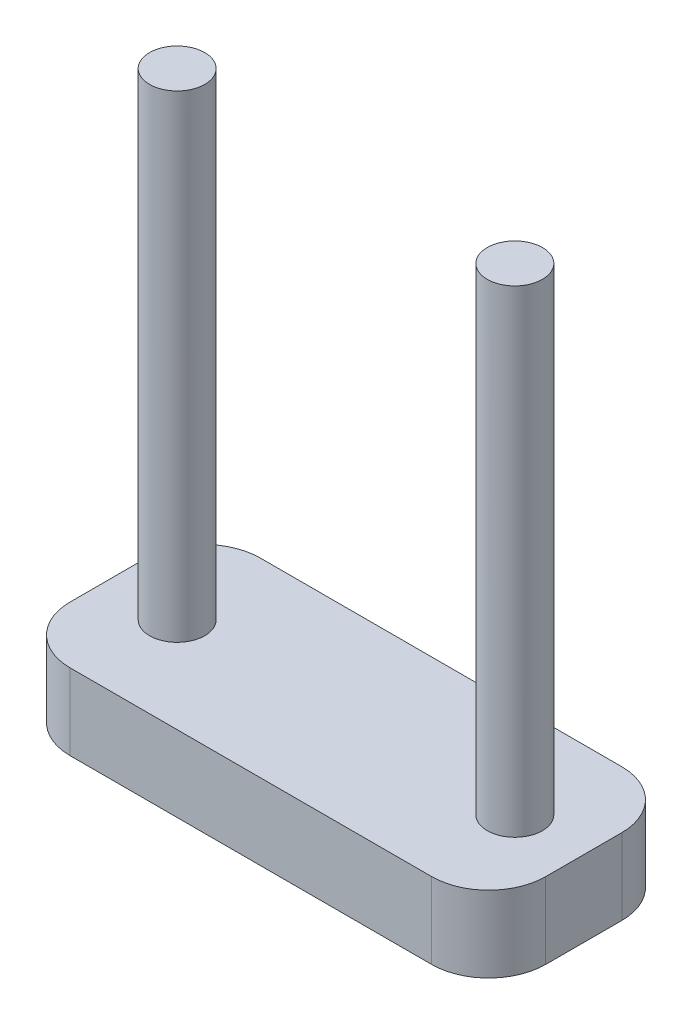
ISO-10303-21;
HEADER;
FILE_DESCRIPTION(('STEP AP214'),'2;1');
FILE_NAME('part.step','',(''),(''),'','','');
FILE_SCHEMA(('AUTOMOTIVE_DESIGN { 1 0 10303 214 1 1 1 1 }'));
ENDSEC;
DATA;
#1=APPLICATION_CONTEXT('core data for automotive mechanical design processes');
#2=APPLICATION_PROTOCOL_DEFINITION('international standard','automotive_design',2000,#1);
#3=PRODUCT_CONTEXT('',#1,'mechanical');
#4=PRODUCT('Part','Part','',(#3));
#5=PRODUCT_RELATED_PRODUCT_CATEGORY('part','',(#4));
#6=PRODUCT_DEFINITION_FORMATION('','',#4);
#7=PRODUCT_DEFINITION_CONTEXT('part definition',#1,'design');
#8=PRODUCT_DEFINITION('design','',#6,#7);
#9=PRODUCT_DEFINITION_SHAPE('','',#8);
#10=(LENGTH_UNIT() NAMED_UNIT(*) SI_UNIT(.MILLI.,.METRE.));
#11=(NAMED_UNIT(*) PLANE_ANGLE_UNIT() SI_UNIT($,.RADIAN.));
#12=(NAMED_UNIT(*) SI_UNIT($,.STERADIAN.) SOLID_ANGLE_UNIT());
#13=UNCERTAINTY_MEASURE_WITH_UNIT(LENGTH_MEASURE(1.E-05),#10,'distance_accuracy_value','');
#14=(GEOMETRIC_REPRESENTATION_CONTEXT(3) GLOBAL_UNCERTAINTY_ASSIGNED_CONTEXT((#13)) GLOBAL_UNIT_ASSIGNED_CONTEXT((#10,
#11,#12)) REPRESENTATION_CONTEXT('',''));
#15=CARTESIAN_POINT('',(0.,0.,0.));
#16=DIRECTION('',(0.,0.,1.));
#17=DIRECTION('',(1.,0.,0.));
#18=AXIS2_PLACEMENT_3D('',#15,#16,#17);
#19=CARTESIAN_POINT('',(12.5,4.,5.));
#20=DIRECTION('',(-1.,0.,0.));
#21=DIRECTION('',(0.,0.,1.));
#22=AXIS2_PLACEMENT_3D('',#19,#20,#21);
#23=PLANE('',#22);
#24=DIRECTION('',(0.,0.,-1.));
#25=VECTOR('',#24,1.);
#26=CARTESIAN_POINT('',(12.5,0.,5.));
#27=LINE('',#26,#25);
#28=CARTESIAN_POINT('',(12.5,0.,2.));
#29=VERTEX_POINT('',#28);
#30=CARTESIAN_POINT('',(12.5,0.,-2.));
#31=VERTEX_POINT('',#30);
#32=EDGE_CURVE('E196',#29,#31,#27,.T.);
#33=ORIENTED_EDGE('',*,*,#32,.T.);
#34=DIRECTION('',(0.,-1.,0.));
#35=VECTOR('',#34,1.);
#36=CARTESIAN_POINT('',(12.5,4.,-2.));
#37=LINE('',#36,#35);
#38=CARTESIAN_POINT('',(12.5,4.,-2.));
#39=VERTEX_POINT('',#38);
#40=EDGE_CURVE('E11',#31,#39,#37,.F.);
#41=ORIENTED_EDGE('',*,*,#40,.T.);
#42=DIRECTION('',(0.,0.,-1.));
#43=VECTOR('',#42,1.);
#44=CARTESIAN_POINT('',(12.5,4.,5.));
#45=LINE('',#44,#43);
#46=CARTESIAN_POINT('',(12.5,4.,2.));
#47=VERTEX_POINT('',#46);
#48=EDGE_CURVE('E141',#47,#39,#45,.T.);
#49=ORIENTED_EDGE('',*,*,#48,.F.);
#50=DIRECTION('',(0.,-1.,0.));
#51=VECTOR('',#50,1.);
#52=CARTESIAN_POINT('',(12.5,4.,2.));
#53=LINE('',#52,#51);
#54=EDGE_CURVE('E54',#47,#29,#53,.T.);
#55=ORIENTED_EDGE('',*,*,#54,.T.);
#56=EDGE_LOOP('',(#33,#41,#49,#55));
#57=FACE_BOUND('',#56,.T.);
#58=ADVANCED_FACE('F45',(#57),#23,.F.);
#59=CARTESIAN_POINT('',(-12.5,4.,-5.));
#60=DIRECTION('',(0.,0.,1.));
#61=DIRECTION('',(1.,0.,0.));
#62=AXIS2_PLACEMENT_3D('',#59,#60,#61);
#63=PLANE('',#62);
#64=DIRECTION('',(-1.,0.,0.));
#65=VECTOR('',#64,1.);
#66=CARTESIAN_POINT('',(-12.5,0.,-5.));
#67=LINE('',#66,#65);
#68=CARTESIAN_POINT('',(9.5,0.,-5.));
#69=VERTEX_POINT('',#68);
#70=CARTESIAN_POINT('',(-9.5,0.,-5.));
#71=VERTEX_POINT('',#70);
#72=EDGE_CURVE('E148',#69,#71,#67,.T.);
#73=ORIENTED_EDGE('',*,*,#72,.T.);
#74=DIRECTION('',(0.,-1.,0.));
#75=VECTOR('',#74,1.);
#76=CARTESIAN_POINT('',(-9.5,4.,-5.));
#77=LINE('',#76,#75);
#78=CARTESIAN_POINT('',(-9.5,4.,-5.));
#79=VERTEX_POINT('',#78);
#80=EDGE_CURVE('E61',#71,#79,#77,.F.);
#81=ORIENTED_EDGE('',*,*,#80,.T.);
#82=DIRECTION('',(-1.,0.,0.));
#83=VECTOR('',#82,1.);
#84=CARTESIAN_POINT('',(-12.5,4.,-5.));
#85=LINE('',#84,#83);
#86=CARTESIAN_POINT('',(9.5,4.,-5.));
#87=VERTEX_POINT('',#86);
#88=EDGE_CURVE('E146',#87,#79,#85,.T.);
#89=ORIENTED_EDGE('',*,*,#88,.F.);
#90=DIRECTION('',(0.,-1.,0.));
#91=VECTOR('',#90,1.);
#92=CARTESIAN_POINT('',(9.5,4.,-5.));
#93=LINE('',#92,#91);
#94=EDGE_CURVE('E185',#87,#69,#93,.T.);
#95=ORIENTED_EDGE('',*,*,#94,.T.);
#96=EDGE_LOOP('',(#73,#81,#89,#95));
#97=FACE_BOUND('',#96,.T.);
#98=ADVANCED_FACE('F243',(#97),#63,.F.);
#99=CARTESIAN_POINT('',(-12.5,4.,5.));
#100=DIRECTION('',(1.,0.,0.));
#101=DIRECTION('',(0.,0.,-1.));
#102=AXIS2_PLACEMENT_3D('',#99,#100,#101);
#103=PLANE('',#102);
#104=DIRECTION('',(0.,0.,1.));
#105=VECTOR('',#104,1.);
#106=CARTESIAN_POINT('',(-12.5,0.,5.));
#107=LINE('',#106,#105);
#108=CARTESIAN_POINT('',(-12.5,0.,-2.));
#109=VERTEX_POINT('',#108);
#110=CARTESIAN_POINT('',(-12.5,0.,2.));
#111=VERTEX_POINT('',#110);
#112=EDGE_CURVE('E142',#109,#111,#107,.T.);
#113=ORIENTED_EDGE('',*,*,#112,.T.);
#114=DIRECTION('',(0.,-1.,0.));
#115=VECTOR('',#114,1.);
#116=CARTESIAN_POINT('',(-12.5,4.,2.));
#117=LINE('',#116,#115);
#118=CARTESIAN_POINT('',(-12.5,4.,2.));
#119=VERTEX_POINT('',#118);
#120=EDGE_CURVE('E117',#111,#119,#117,.F.);
#121=ORIENTED_EDGE('',*,*,#120,.T.);
#122=DIRECTION('',(0.,0.,1.));
#123=VECTOR('',#122,1.);
#124=CARTESIAN_POINT('',(-12.5,4.,5.));
#125=LINE('',#124,#123);
#126=CARTESIAN_POINT('',(-12.5,4.,-2.));
#127=VERTEX_POINT('',#126);
#128=EDGE_CURVE('E212',#127,#119,#125,.T.);
#129=ORIENTED_EDGE('',*,*,#128,.F.);
#130=DIRECTION('',(0.,-1.,0.));
#131=VECTOR('',#130,1.);
#132=CARTESIAN_POINT('',(-12.5,4.,-2.));
#133=LINE('',#132,#131);
#134=EDGE_CURVE('E123',#127,#109,#133,.T.);
#135=ORIENTED_EDGE('',*,*,#134,.T.);
#136=EDGE_LOOP('',(#113,#121,#129,#135));
#137=FACE_BOUND('',#136,.T.);
#138=ADVANCED_FACE('F240',(#137),#103,.F.);
#139=CARTESIAN_POINT('',(-12.5,4.,5.));
#140=DIRECTION('',(0.,0.,-1.));
#141=DIRECTION('',(-1.,0.,0.));
#142=AXIS2_PLACEMENT_3D('',#139,#140,#141);
#143=PLANE('',#142);
#144=DIRECTION('',(1.,0.,0.));
#145=VECTOR('',#144,1.);
#146=CARTESIAN_POINT('',(-12.5,4.,5.));
#147=LINE('',#146,#145);
#148=CARTESIAN_POINT('',(-9.5,4.,5.));
#149=VERTEX_POINT('',#148);
#150=CARTESIAN_POINT('',(9.5,4.,5.));
#151=VERTEX_POINT('',#150);
#152=EDGE_CURVE('E133',#149,#151,#147,.T.);
#153=ORIENTED_EDGE('',*,*,#152,.F.);
#154=DIRECTION('',(0.,-1.,0.));
#155=VECTOR('',#154,1.);
#156=CARTESIAN_POINT('',(-9.5,4.,5.));
#157=LINE('',#156,#155);
#158=CARTESIAN_POINT('',(-9.5,0.,5.));
#159=VERTEX_POINT('',#158);
#160=EDGE_CURVE('E116',#149,#159,#157,.T.);
#161=ORIENTED_EDGE('',*,*,#160,.T.);
#162=DIRECTION('',(1.,0.,0.));
#163=VECTOR('',#162,1.);
#164=CARTESIAN_POINT('',(-12.5,0.,5.));
#165=LINE('',#164,#163);
#166=CARTESIAN_POINT('',(9.5,0.,5.));
#167=VERTEX_POINT('',#166);
#168=EDGE_CURVE('E130',#159,#167,#165,.T.);
#169=ORIENTED_EDGE('',*,*,#168,.T.);
#170=DIRECTION('',(0.,-1.,0.));
#171=VECTOR('',#170,1.);
#172=CARTESIAN_POINT('',(9.5,4.,5.));
#173=LINE('',#172,#171);
#174=EDGE_CURVE('E136',#167,#151,#173,.F.);
#175=ORIENTED_EDGE('',*,*,#174,.T.);
#176=EDGE_LOOP('',(#153,#161,#169,#175));
#177=FACE_BOUND('',#176,.T.);
#178=ADVANCED_FACE('F129',(#177),#143,.F.);
#179=CARTESIAN_POINT('',(0.,4.,0.));
#180=DIRECTION('',(0.,-1.,0.));
#181=DIRECTION('',(0.,0.,-1.));
#182=AXIS2_PLACEMENT_3D('',#179,#180,#181);
#183=PLANE('',#182);
#184=CARTESIAN_POINT('',(-8.875,4.,0.));
#185=DIRECTION('',(0.,-1.,0.));
#186=DIRECTION('',(0.,0.,-1.));
#187=AXIS2_PLACEMENT_3D('',#184,#185,#186);
#188=CIRCLE('',#187,1.45);
#189=CARTESIAN_POINT('',(-8.875,4.,-1.45));
#190=VERTEX_POINT('',#189);
#191=EDGE_CURVE('E156',#190,#190,#188,.F.);
#192=ORIENTED_EDGE('',*,*,#191,.F.);
#193=EDGE_LOOP('',(#192));
#194=FACE_BOUND('',#193,.T.);
#195=CARTESIAN_POINT('',(8.875,4.,0.));
#196=DIRECTION('',(0.,-1.,0.));
#197=DIRECTION('',(0.,0.,-1.));
#198=AXIS2_PLACEMENT_3D('',#195,#196,#197);
#199=CIRCLE('',#198,1.45);
#200=CARTESIAN_POINT('',(8.875,4.,-1.45));
#201=VERTEX_POINT('',#200);
#202=EDGE_CURVE('E152',#201,#201,#199,.F.);
#203=ORIENTED_EDGE('',*,*,#202,.F.);
#204=EDGE_LOOP('',(#203));
#205=FACE_BOUND('',#204,.T.);
#206=ORIENTED_EDGE('',*,*,#128,.T.);
#207=CARTESIAN_POINT('',(-9.5,4.,2.));
#208=DIRECTION('',(0.,-1.,0.));
#209=DIRECTION('',(0.,0.,-1.));
#210=AXIS2_PLACEMENT_3D('',#207,#208,#209);
#211=CIRCLE('',#210,3.);
#212=EDGE_CURVE('E182',#119,#149,#211,.F.);
#213=ORIENTED_EDGE('',*,*,#212,.T.);
#214=ORIENTED_EDGE('',*,*,#152,.T.);
#215=CARTESIAN_POINT('',(9.5,4.,2.));
#216=DIRECTION('',(0.,-1.,0.));
#217=DIRECTION('',(0.,0.,-1.));
#218=AXIS2_PLACEMENT_3D('',#215,#216,#217);
#219=CIRCLE('',#218,3.);
#220=EDGE_CURVE('E174',#151,#47,#219,.F.);
#221=ORIENTED_EDGE('',*,*,#220,.T.);
#222=ORIENTED_EDGE('',*,*,#48,.T.);
#223=CARTESIAN_POINT('',(9.5,4.,-2.));
#224=DIRECTION('',(0.,-1.,0.));
#225=DIRECTION('',(0.,0.,-1.));
#226=AXIS2_PLACEMENT_3D('',#223,#224,#225);
#227=CIRCLE('',#226,3.);
#228=EDGE_CURVE('E68',#39,#87,#227,.F.);
#229=ORIENTED_EDGE('',*,*,#228,.T.);
#230=ORIENTED_EDGE('',*,*,#88,.T.);
#231=CARTESIAN_POINT('',(-9.5,4.,-2.));
#232=DIRECTION('',(0.,-1.,0.));
#233=DIRECTION('',(0.,0.,-1.));
#234=AXIS2_PLACEMENT_3D('',#231,#232,#233);
#235=CIRCLE('',#234,3.);
#236=EDGE_CURVE('E179',#79,#127,#235,.F.);
#237=ORIENTED_EDGE('',*,*,#236,.T.);
#238=EDGE_LOOP('',(#206,#213,#214,#221,#222,#229,#230,#237));
#239=FACE_BOUND('',#238,.T.);
#240=ADVANCED_FACE('F231',(#194,#205,#239),#183,.F.);
#241=CARTESIAN_POINT('',(0.,0.,0.));
#242=DIRECTION('',(0.,-1.,0.));
#243=DIRECTION('',(0.,0.,-1.));
#244=AXIS2_PLACEMENT_3D('',#241,#242,#243);
#245=PLANE('',#244);
#246=ORIENTED_EDGE('',*,*,#168,.F.);
#247=CARTESIAN_POINT('',(-9.5,0.,2.));
#248=DIRECTION('',(0.,-1.,0.));
#249=DIRECTION('',(0.,0.,-1.));
#250=AXIS2_PLACEMENT_3D('',#247,#248,#249);
#251=CIRCLE('',#250,3.);
#252=EDGE_CURVE('E112',#159,#111,#251,.T.);
#253=ORIENTED_EDGE('',*,*,#252,.T.);
#254=ORIENTED_EDGE('',*,*,#112,.F.);
#255=CARTESIAN_POINT('',(-9.5,0.,-2.));
#256=DIRECTION('',(0.,-1.,0.));
#257=DIRECTION('',(0.,0.,-1.));
#258=AXIS2_PLACEMENT_3D('',#255,#256,#257);
#259=CIRCLE('',#258,3.);
#260=EDGE_CURVE('E124',#109,#71,#259,.T.);
#261=ORIENTED_EDGE('',*,*,#260,.T.);
#262=ORIENTED_EDGE('',*,*,#72,.F.);
#263=CARTESIAN_POINT('',(9.5,0.,-2.));
#264=DIRECTION('',(0.,-1.,0.));
#265=DIRECTION('',(0.,0.,-1.));
#266=AXIS2_PLACEMENT_3D('',#263,#264,#265);
#267=CIRCLE('',#266,3.);
#268=EDGE_CURVE('E164',#69,#31,#267,.T.);
#269=ORIENTED_EDGE('',*,*,#268,.T.);
#270=ORIENTED_EDGE('',*,*,#32,.F.);
#271=CARTESIAN_POINT('',(9.5,0.,2.));
#272=DIRECTION('',(0.,-1.,0.));
#273=DIRECTION('',(0.,0.,-1.));
#274=AXIS2_PLACEMENT_3D('',#271,#272,#273);
#275=CIRCLE('',#274,3.);
#276=EDGE_CURVE('E135',#29,#167,#275,.T.);
#277=ORIENTED_EDGE('',*,*,#276,.T.);
#278=EDGE_LOOP('',(#246,#253,#254,#261,#262,#269,#270,#277));
#279=FACE_BOUND('',#278,.T.);
#280=ADVANCED_FACE('F138',(#279),#245,.T.);
#281=CARTESIAN_POINT('',(8.875,29.1,0.));
#282=DIRECTION('',(0.,-1.,0.));
#283=DIRECTION('',(0.,0.,-1.));
#284=AXIS2_PLACEMENT_3D('',#281,#282,#283);
#285=CYLINDRICAL_SURFACE('',#284,1.45);
#286=CARTESIAN_POINT('',(8.875,29.1,0.));
#287=DIRECTION('',(0.,1.,0.));
#288=DIRECTION('',(0.,0.,1.));
#289=AXIS2_PLACEMENT_3D('',#286,#287,#288);
#290=CIRCLE('',#289,1.45);
#291=CARTESIAN_POINT('',(8.875,29.1,1.45));
#292=VERTEX_POINT('',#291);
#293=EDGE_CURVE('E202',#292,#292,#290,.T.);
#294=ORIENTED_EDGE('',*,*,#293,.F.);
#295=EDGE_LOOP('',(#294));
#296=FACE_BOUND('',#295,.T.);
#297=ORIENTED_EDGE('',*,*,#202,.T.);
#298=EDGE_LOOP('',(#297));
#299=FACE_BOUND('',#298,.T.);
#300=ADVANCED_FACE('F302',(#296,#299),#285,.T.);
#301=CARTESIAN_POINT('',(8.875,29.1,0.));
#302=DIRECTION('',(0.,1.,0.));
#303=DIRECTION('',(0.,0.,1.));
#304=AXIS2_PLACEMENT_3D('',#301,#302,#303);
#305=PLANE('',#304);
#306=ORIENTED_EDGE('',*,*,#293,.T.);
#307=EDGE_LOOP('',(#306));
#308=FACE_BOUND('',#307,.T.);
#309=ADVANCED_FACE('F227',(#308),#305,.T.);
#310=CARTESIAN_POINT('',(-8.875,29.1,0.));
#311=DIRECTION('',(0.,-1.,0.));
#312=DIRECTION('',(0.,0.,-1.));
#313=AXIS2_PLACEMENT_3D('',#310,#311,#312);
#314=CYLINDRICAL_SURFACE('',#313,1.45);
#315=CARTESIAN_POINT('',(-8.875,29.1,0.));
#316=DIRECTION('',(0.,1.,0.));
#317=DIRECTION('',(0.,0.,1.));
#318=AXIS2_PLACEMENT_3D('',#315,#316,#317);
#319=CIRCLE('',#318,1.45);
#320=CARTESIAN_POINT('',(-8.875,29.1,1.45));
#321=VERTEX_POINT('',#320);
#322=EDGE_CURVE('E207',#321,#321,#319,.T.);
#323=ORIENTED_EDGE('',*,*,#322,.F.);
#324=EDGE_LOOP('',(#323));
#325=FACE_BOUND('',#324,.T.);
#326=ORIENTED_EDGE('',*,*,#191,.T.);
#327=EDGE_LOOP('',(#326));
#328=FACE_BOUND('',#327,.T.);
#329=ADVANCED_FACE('F224',(#325,#328),#314,.T.);
#330=CARTESIAN_POINT('',(-8.875,29.1,0.));
#331=DIRECTION('',(0.,1.,0.));
#332=DIRECTION('',(0.,0.,1.));
#333=AXIS2_PLACEMENT_3D('',#330,#331,#332);
#334=PLANE('',#333);
#335=ORIENTED_EDGE('',*,*,#322,.T.);
#336=EDGE_LOOP('',(#335));
#337=FACE_BOUND('',#336,.T.);
#338=ADVANCED_FACE('F222',(#337),#334,.T.);
#339=CARTESIAN_POINT('',(-9.5,4.,2.));
#340=DIRECTION('',(0.,-1.,0.));
#341=DIRECTION('',(0.,0.,-1.));
#342=AXIS2_PLACEMENT_3D('',#339,#340,#341);
#343=CYLINDRICAL_SURFACE('',#342,3.);
#344=ORIENTED_EDGE('',*,*,#212,.F.);
#345=ORIENTED_EDGE('',*,*,#120,.F.);
#346=ORIENTED_EDGE('',*,*,#252,.F.);
#347=ORIENTED_EDGE('',*,*,#160,.F.);
#348=EDGE_LOOP('',(#344,#345,#346,#347));
#349=FACE_BOUND('',#348,.T.);
#350=ADVANCED_FACE('F115',(#349),#343,.T.);
#351=CARTESIAN_POINT('',(-9.5,4.,-2.));
#352=DIRECTION('',(0.,-1.,0.));
#353=DIRECTION('',(0.,0.,-1.));
#354=AXIS2_PLACEMENT_3D('',#351,#352,#353);
#355=CYLINDRICAL_SURFACE('',#354,3.);
#356=ORIENTED_EDGE('',*,*,#236,.F.);
#357=ORIENTED_EDGE('',*,*,#80,.F.);
#358=ORIENTED_EDGE('',*,*,#260,.F.);
#359=ORIENTED_EDGE('',*,*,#134,.F.);
#360=EDGE_LOOP('',(#356,#357,#358,#359));
#361=FACE_BOUND('',#360,.T.);
#362=ADVANCED_FACE('F242',(#361),#355,.T.);
#363=CARTESIAN_POINT('',(9.5,4.,-2.));
#364=DIRECTION('',(0.,-1.,0.));
#365=DIRECTION('',(0.,0.,-1.));
#366=AXIS2_PLACEMENT_3D('',#363,#364,#365);
#367=CYLINDRICAL_SURFACE('',#366,3.);
#368=ORIENTED_EDGE('',*,*,#228,.F.);
#369=ORIENTED_EDGE('',*,*,#40,.F.);
#370=ORIENTED_EDGE('',*,*,#268,.F.);
#371=ORIENTED_EDGE('',*,*,#94,.F.);
#372=EDGE_LOOP('',(#368,#369,#370,#371));
#373=FACE_BOUND('',#372,.T.);
#374=ADVANCED_FACE('F246',(#373),#367,.T.);
#375=CARTESIAN_POINT('',(9.5,4.,2.));
#376=DIRECTION('',(0.,-1.,0.));
#377=DIRECTION('',(0.,0.,-1.));
#378=AXIS2_PLACEMENT_3D('',#375,#376,#377);
#379=CYLINDRICAL_SURFACE('',#378,3.);
#380=ORIENTED_EDGE('',*,*,#220,.F.);
#381=ORIENTED_EDGE('',*,*,#174,.F.);
#382=ORIENTED_EDGE('',*,*,#276,.F.);
#383=ORIENTED_EDGE('',*,*,#54,.F.);
#384=EDGE_LOOP('',(#380,#381,#382,#383));
#385=FACE_BOUND('',#384,.T.);
#386=ADVANCED_FACE('F47',(#385),#379,.T.);
#387=CLOSED_SHELL('',(#58,#98,#138,#178,#240,#280,#300,#309,#329,#338,#350,#362,#374,#386));
#388=MANIFOLD_SOLID_BREP('B2',#387);
#389=ADVANCED_BREP_SHAPE_REPRESENTATION('',(#18,#388),#14);
#390=SHAPE_DEFINITION_REPRESENTATION(#9,#389);
ENDSEC;
END-ISO-10303-21;
